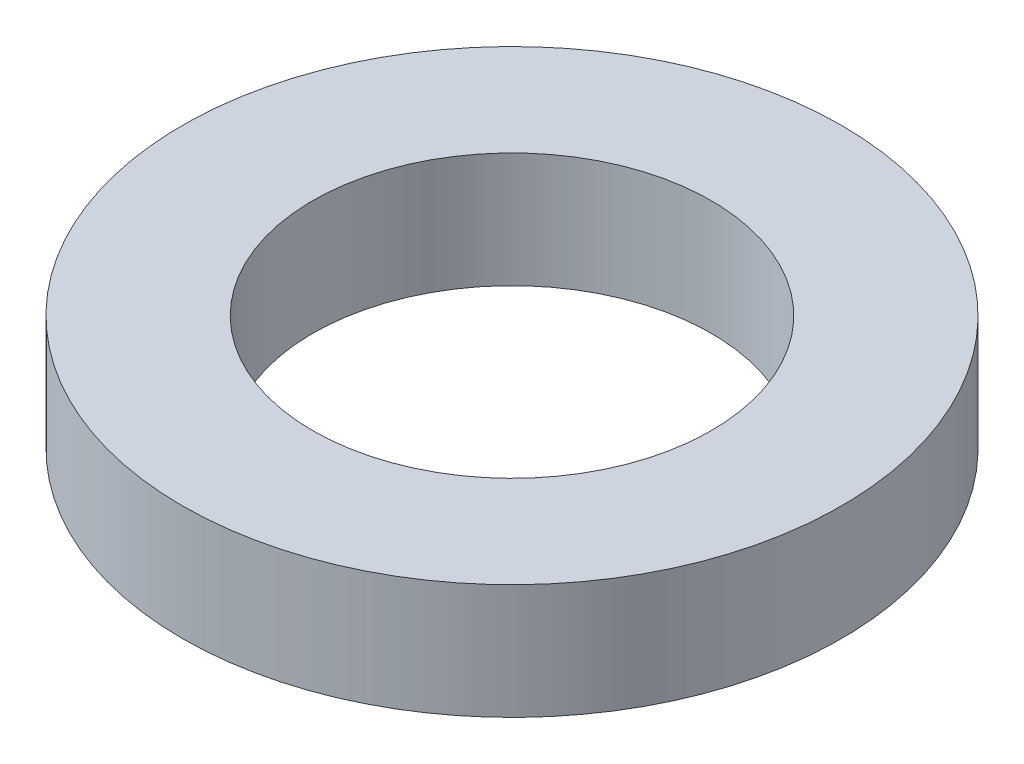
ISO-10303-21;
HEADER;
FILE_DESCRIPTION(('STEP AP214'),'2;1');
FILE_NAME('part.step','',(''),(''),'','','');
FILE_SCHEMA(('AUTOMOTIVE_DESIGN { 1 0 10303 214 1 1 1 1 }'));
ENDSEC;
DATA;
#1=APPLICATION_CONTEXT('core data for automotive mechanical design processes');
#2=APPLICATION_PROTOCOL_DEFINITION('international standard','automotive_design',2000,#1);
#3=PRODUCT_CONTEXT('',#1,'mechanical');
#4=PRODUCT('Part','Part','',(#3));
#5=PRODUCT_RELATED_PRODUCT_CATEGORY('part','',(#4));
#6=PRODUCT_DEFINITION_FORMATION('','',#4);
#7=PRODUCT_DEFINITION_CONTEXT('part definition',#1,'design');
#8=PRODUCT_DEFINITION('design','',#6,#7);
#9=PRODUCT_DEFINITION_SHAPE('','',#8);
#10=(LENGTH_UNIT() NAMED_UNIT(*) SI_UNIT(.MILLI.,.METRE.));
#11=(NAMED_UNIT(*) PLANE_ANGLE_UNIT() SI_UNIT($,.RADIAN.));
#12=(NAMED_UNIT(*) SI_UNIT($,.STERADIAN.) SOLID_ANGLE_UNIT());
#13=UNCERTAINTY_MEASURE_WITH_UNIT(LENGTH_MEASURE(1.E-05),#10,'distance_accuracy_value','');
#14=(GEOMETRIC_REPRESENTATION_CONTEXT(3) GLOBAL_UNCERTAINTY_ASSIGNED_CONTEXT((#13)) GLOBAL_UNIT_ASSIGNED_CONTEXT((#10,
#11,#12)) REPRESENTATION_CONTEXT('',''));
#15=CARTESIAN_POINT('',(0.,0.,0.));
#16=DIRECTION('',(0.,0.,1.));
#17=DIRECTION('',(1.,0.,0.));
#18=AXIS2_PLACEMENT_3D('',#15,#16,#17);
#19=CARTESIAN_POINT('',(0.,15.,0.));
#20=DIRECTION('',(0.,-1.,0.));
#21=DIRECTION('',(0.,0.,-1.));
#22=AXIS2_PLACEMENT_3D('',#19,#20,#21);
#23=CYLINDRICAL_SURFACE('',#22,43.);
#24=CARTESIAN_POINT('',(0.,15.,0.));
#25=DIRECTION('',(0.,1.,0.));
#26=DIRECTION('',(0.,0.,1.));
#27=AXIS2_PLACEMENT_3D('',#24,#25,#26);
#28=CIRCLE('',#27,43.);
#29=CARTESIAN_POINT('',(0.,15.,43.));
#30=VERTEX_POINT('',#29);
#31=EDGE_CURVE('E10',#30,#30,#28,.T.);
#32=ORIENTED_EDGE('',*,*,#31,.F.);
#33=EDGE_LOOP('',(#32));
#34=FACE_BOUND('',#33,.T.);
#35=CARTESIAN_POINT('',(0.,0.,0.));
#36=DIRECTION('',(0.,1.,0.));
#37=DIRECTION('',(0.,0.,1.));
#38=AXIS2_PLACEMENT_3D('',#35,#36,#37);
#39=CIRCLE('',#38,43.);
#40=CARTESIAN_POINT('',(0.,0.,43.));
#41=VERTEX_POINT('',#40);
#42=EDGE_CURVE('E34',#41,#41,#39,.T.);
#43=ORIENTED_EDGE('',*,*,#42,.T.);
#44=EDGE_LOOP('',(#43));
#45=FACE_BOUND('',#44,.T.);
#46=ADVANCED_FACE('F31',(#34,#45),#23,.T.);
#47=CARTESIAN_POINT('',(0.,15.,0.));
#48=DIRECTION('',(0.,1.,0.));
#49=DIRECTION('',(0.,0.,1.));
#50=AXIS2_PLACEMENT_3D('',#47,#48,#49);
#51=PLANE('',#50);
#52=CARTESIAN_POINT('',(0.,15.,0.));
#53=DIRECTION('',(0.,1.,0.));
#54=DIRECTION('',(0.,0.,1.));
#55=AXIS2_PLACEMENT_3D('',#52,#53,#54);
#56=CIRCLE('',#55,26.);
#57=CARTESIAN_POINT('',(0.,15.,26.));
#58=VERTEX_POINT('',#57);
#59=EDGE_CURVE('E43',#58,#58,#56,.T.);
#60=ORIENTED_EDGE('',*,*,#59,.F.);
#61=EDGE_LOOP('',(#60));
#62=FACE_BOUND('',#61,.T.);
#63=ORIENTED_EDGE('',*,*,#31,.T.);
#64=EDGE_LOOP('',(#63));
#65=FACE_BOUND('',#64,.T.);
#66=ADVANCED_FACE('F58',(#62,#65),#51,.T.);
#67=CARTESIAN_POINT('',(0.,0.,0.));
#68=DIRECTION('',(0.,1.,0.));
#69=DIRECTION('',(0.,0.,1.));
#70=AXIS2_PLACEMENT_3D('',#67,#68,#69);
#71=PLANE('',#70);
#72=CARTESIAN_POINT('',(0.,0.,0.));
#73=DIRECTION('',(0.,1.,0.));
#74=DIRECTION('',(0.,0.,1.));
#75=AXIS2_PLACEMENT_3D('',#72,#73,#74);
#76=CIRCLE('',#75,26.);
#77=CARTESIAN_POINT('',(0.,0.,26.));
#78=VERTEX_POINT('',#77);
#79=EDGE_CURVE('E41',#78,#78,#76,.T.);
#80=ORIENTED_EDGE('',*,*,#79,.T.);
#81=EDGE_LOOP('',(#80));
#82=FACE_BOUND('',#81,.T.);
#83=ORIENTED_EDGE('',*,*,#42,.F.);
#84=EDGE_LOOP('',(#83));
#85=FACE_BOUND('',#84,.T.);
#86=ADVANCED_FACE('F49',(#82,#85),#71,.F.);
#87=CARTESIAN_POINT('',(0.,0.,0.));
#88=DIRECTION('',(0.,1.,0.));
#89=DIRECTION('',(0.,0.,1.));
#90=AXIS2_PLACEMENT_3D('',#87,#88,#89);
#91=CYLINDRICAL_SURFACE('',#90,26.);
#92=ORIENTED_EDGE('',*,*,#79,.F.);
#93=EDGE_LOOP('',(#92));
#94=FACE_BOUND('',#93,.T.);
#95=ORIENTED_EDGE('',*,*,#59,.T.);
#96=EDGE_LOOP('',(#95));
#97=FACE_BOUND('',#96,.T.);
#98=ADVANCED_FACE('F52',(#94,#97),#91,.F.);
#99=CLOSED_SHELL('',(#46,#66,#86,#98));
#100=MANIFOLD_SOLID_BREP('B2',#99);
#101=ADVANCED_BREP_SHAPE_REPRESENTATION('',(#18,#100),#14);
#102=SHAPE_DEFINITION_REPRESENTATION(#9,#101);
ENDSEC;
END-ISO-10303-21;
